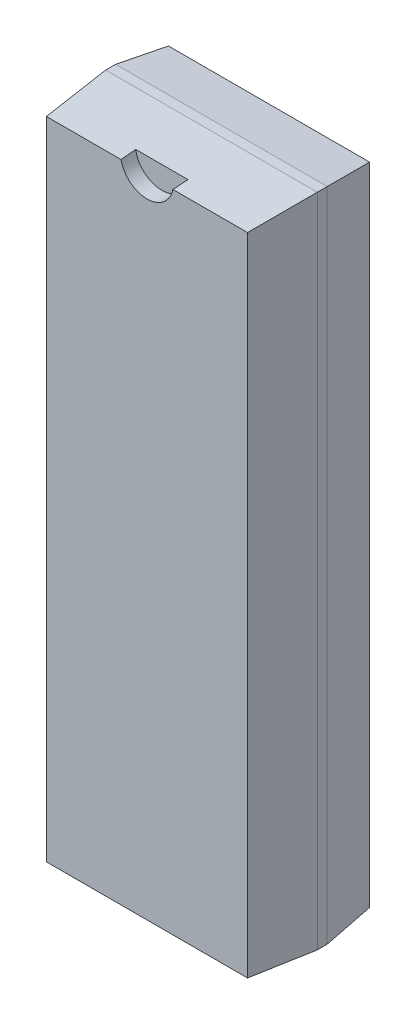
ISO-10303-21;
HEADER;
FILE_DESCRIPTION(('STEP AP214'),'2;1');
FILE_NAME('part.step','',(''),(''),'','','');
FILE_SCHEMA(('AUTOMOTIVE_DESIGN { 1 0 10303 214 1 1 1 1 }'));
ENDSEC;
DATA;
#1=APPLICATION_CONTEXT('core data for automotive mechanical design processes');
#2=APPLICATION_PROTOCOL_DEFINITION('international standard','automotive_design',2000,#1);
#3=PRODUCT_CONTEXT('',#1,'mechanical');
#4=PRODUCT('Part','Part','',(#3));
#5=PRODUCT_RELATED_PRODUCT_CATEGORY('part','',(#4));
#6=PRODUCT_DEFINITION_FORMATION('','',#4);
#7=PRODUCT_DEFINITION_CONTEXT('part definition',#1,'design');
#8=PRODUCT_DEFINITION('design','',#6,#7);
#9=PRODUCT_DEFINITION_SHAPE('','',#8);
#10=(LENGTH_UNIT() NAMED_UNIT(*) SI_UNIT(.MILLI.,.METRE.));
#11=(NAMED_UNIT(*) PLANE_ANGLE_UNIT() SI_UNIT($,.RADIAN.));
#12=(NAMED_UNIT(*) SI_UNIT($,.STERADIAN.) SOLID_ANGLE_UNIT());
#13=UNCERTAINTY_MEASURE_WITH_UNIT(LENGTH_MEASURE(1.E-05),#10,'distance_accuracy_value','');
#14=(GEOMETRIC_REPRESENTATION_CONTEXT(3) GLOBAL_UNCERTAINTY_ASSIGNED_CONTEXT((#13)) GLOBAL_UNIT_ASSIGNED_CONTEXT((#10,
#11,#12)) REPRESENTATION_CONTEXT('',''));
#15=CARTESIAN_POINT('',(0.,0.,0.));
#16=DIRECTION('',(0.,0.,1.));
#17=DIRECTION('',(1.,0.,0.));
#18=AXIS2_PLACEMENT_3D('',#15,#16,#17);
#19=CARTESIAN_POINT('',(0.,9.92,4.05));
#20=DIRECTION('',(0.,0.,1.));
#21=DIRECTION('',(1.,0.,0.));
#22=AXIS2_PLACEMENT_3D('',#19,#20,#21);
#23=PLANE('',#22);
#24=DIRECTION('',(-1.,0.,0.));
#25=VECTOR('',#24,1.);
#26=CARTESIAN_POINT('',(-1.6,9.796923076923,4.05));
#27=LINE('',#26,#25);
#28=CARTESIAN_POINT('',(0.790475850995,9.796923076923,4.05));
#29=VERTEX_POINT('',#28);
#30=CARTESIAN_POINT('',(-0.790475850995,9.796923076923,4.05));
#31=VERTEX_POINT('',#30);
#32=EDGE_CURVE('E168',#29,#31,#27,.T.);
#33=ORIENTED_EDGE('',*,*,#32,.T.);
#34=CARTESIAN_POINT('',(0.,9.92,4.05));
#35=DIRECTION('',(0.,0.,1.));
#36=DIRECTION('',(1.,0.,0.));
#37=AXIS2_PLACEMENT_3D('',#34,#35,#36);
#38=CIRCLE('',#37,0.8);
#39=EDGE_CURVE('E11',#31,#29,#38,.T.);
#40=ORIENTED_EDGE('',*,*,#39,.T.);
#41=EDGE_LOOP('',(#33,#40));
#42=FACE_BOUND('',#41,.T.);
#43=ADVANCED_FACE('F16',(#42),#23,.T.);
#44=CARTESIAN_POINT('',(0.,9.92,4.05));
#45=DIRECTION('',(0.,0.,1.));
#46=DIRECTION('',(1.,0.,0.));
#47=AXIS2_PLACEMENT_3D('',#44,#45,#46);
#48=CYLINDRICAL_SURFACE('',#47,0.8);
#49=CARTESIAN_POINT('',(0.,9.92,2.55));
#50=DIRECTION('',(0.,0.99665069577484,0.0817764673456069));
#51=DIRECTION('',(0.,-0.0817764673456069,0.99665069577484));
#52=AXIS2_PLACEMENT_3D('',#49,#50,#51);
#53=ELLIPSE('',#52,9.782765457681,0.8);
#54=CARTESIAN_POINT('',(0.783836717691,9.76,4.5));
#55=VERTEX_POINT('',#54);
#56=EDGE_CURVE('E171',#55,#29,#53,.T.);
#57=ORIENTED_EDGE('',*,*,#56,.T.);
#58=ORIENTED_EDGE('',*,*,#39,.F.);
#59=CARTESIAN_POINT('',(0.,9.92,2.55));
#60=DIRECTION('',(0.,0.99665069577484,0.0817764673456069));
#61=DIRECTION('',(0.,-0.0817764673456069,0.99665069577484));
#62=AXIS2_PLACEMENT_3D('',#59,#60,#61);
#63=ELLIPSE('',#62,9.782765457681,0.8);
#64=CARTESIAN_POINT('',(-0.783836717691,9.76,4.5));
#65=VERTEX_POINT('',#64);
#66=EDGE_CURVE('E172',#31,#65,#63,.T.);
#67=ORIENTED_EDGE('',*,*,#66,.T.);
#68=CARTESIAN_POINT('',(0.,9.92,4.5));
#69=DIRECTION('',(0.,0.,1.));
#70=DIRECTION('',(1.,0.,0.));
#71=AXIS2_PLACEMENT_3D('',#68,#69,#70);
#72=CIRCLE('',#71,0.8);
#73=EDGE_CURVE('E226',#65,#55,#72,.T.);
#74=ORIENTED_EDGE('',*,*,#73,.T.);
#75=EDGE_LOOP('',(#57,#58,#67,#74));
#76=FACE_BOUND('',#75,.T.);
#77=ADVANCED_FACE('F242',(#76),#48,.F.);
#78=CARTESIAN_POINT('',(3.12,-9.92,3.525));
#79=DIRECTION('',(0.99665069577484,0.,0.0817764673456069));
#80=DIRECTION('',(0.,-1.,0.));
#81=AXIS2_PLACEMENT_3D('',#78,#79,#80);
#82=PLANE('',#81);
#83=DIRECTION('',(-0.0815043955853222,0.0815043955853222,0.993334821196027));
#84=VECTOR('',#83,1.);
#85=CARTESIAN_POINT('',(3.099273944521,-9.819273944521,3.777598801152));
#86=LINE('',#85,#84);
#87=CARTESIAN_POINT('',(3.2,-9.92,2.55));
#88=VERTEX_POINT('',#87);
#89=CARTESIAN_POINT('',(3.04,-9.76,4.5));
#90=VERTEX_POINT('',#89);
#91=EDGE_CURVE('E181',#88,#90,#86,.T.);
#92=ORIENTED_EDGE('',*,*,#91,.F.);
#93=DIRECTION('',(0.,1.,0.));
#94=VECTOR('',#93,1.);
#95=CARTESIAN_POINT('',(3.2,-9.92,2.55));
#96=LINE('',#95,#94);
#97=CARTESIAN_POINT('',(3.2,9.92,2.55));
#98=VERTEX_POINT('',#97);
#99=EDGE_CURVE('E132',#88,#98,#96,.T.);
#100=ORIENTED_EDGE('',*,*,#99,.T.);
#101=DIRECTION('',(-0.0815043955853222,-0.0815043955853222,0.993334821196027));
#102=VECTOR('',#101,1.);
#103=CARTESIAN_POINT('',(3.033375716844,9.753375716844,4.580733450969));
#104=LINE('',#103,#102);
#105=CARTESIAN_POINT('',(3.04,9.76,4.5));
#106=VERTEX_POINT('',#105);
#107=EDGE_CURVE('E27',#98,#106,#104,.T.);
#108=ORIENTED_EDGE('',*,*,#107,.T.);
#109=DIRECTION('',(0.,1.,0.));
#110=VECTOR('',#109,1.);
#111=CARTESIAN_POINT('',(3.04,-9.92,4.5));
#112=LINE('',#111,#110);
#113=EDGE_CURVE('E120',#90,#106,#112,.T.);
#114=ORIENTED_EDGE('',*,*,#113,.F.);
#115=EDGE_LOOP('',(#92,#100,#108,#114));
#116=FACE_BOUND('',#115,.T.);
#117=ADVANCED_FACE('F253',(#116),#82,.T.);
#118=CARTESIAN_POINT('',(3.12,-9.92,1.53));
#119=DIRECTION('',(-0.993883734673607,0.,0.110431526074956));
#120=DIRECTION('',(0.,1.,0.));
#121=AXIS2_PLACEMENT_3D('',#118,#119,#120);
#122=PLANE('',#121);
#123=DIRECTION('',(0.,1.,0.));
#124=VECTOR('',#123,1.);
#125=CARTESIAN_POINT('',(3.04,-9.92,0.81));
#126=LINE('',#125,#124);
#127=CARTESIAN_POINT('',(3.04,-9.76,0.81));
#128=VERTEX_POINT('',#127);
#129=CARTESIAN_POINT('',(3.04,9.76,0.81));
#130=VERTEX_POINT('',#129);
#131=EDGE_CURVE('E115',#128,#130,#126,.T.);
#132=ORIENTED_EDGE('',*,*,#131,.T.);
#133=DIRECTION('',(-0.109764259990016,-0.109764259990016,-0.987878339907141));
#134=VECTOR('',#133,1.);
#135=CARTESIAN_POINT('',(2.962891566265,9.682891566265,0.116024096386));
#136=LINE('',#135,#134);
#137=CARTESIAN_POINT('',(3.2,9.92,2.25));
#138=VERTEX_POINT('',#137);
#139=EDGE_CURVE('E109',#138,#130,#136,.T.);
#140=ORIENTED_EDGE('',*,*,#139,.F.);
#141=DIRECTION('',(0.,1.,0.));
#142=VECTOR('',#141,1.);
#143=CARTESIAN_POINT('',(3.2,-9.92,2.25));
#144=LINE('',#143,#142);
#145=CARTESIAN_POINT('',(3.2,-9.92,2.25));
#146=VERTEX_POINT('',#145);
#147=EDGE_CURVE('E113',#146,#138,#144,.T.);
#148=ORIENTED_EDGE('',*,*,#147,.F.);
#149=DIRECTION('',(-0.109764259990016,0.109764259990016,-0.987878339907141));
#150=VECTOR('',#149,1.);
#151=CARTESIAN_POINT('',(3.082409638554,-9.802409638554,1.191686746988));
#152=LINE('',#151,#150);
#153=EDGE_CURVE('E194',#146,#128,#152,.T.);
#154=ORIENTED_EDGE('',*,*,#153,.T.);
#155=EDGE_LOOP('',(#132,#140,#148,#154));
#156=FACE_BOUND('',#155,.T.);
#157=ADVANCED_FACE('F111',(#156),#122,.F.);
#158=CARTESIAN_POINT('',(-3.2,9.84,3.525));
#159=DIRECTION('',(0.,0.99665069577484,0.0817764673456069));
#160=DIRECTION('',(1.,0.,0.));
#161=AXIS2_PLACEMENT_3D('',#158,#159,#160);
#162=PLANE('',#161);
#163=DIRECTION('',(1.,0.,0.));
#164=VECTOR('',#163,1.);
#165=CARTESIAN_POINT('',(-3.2,9.76,4.5));
#166=LINE('',#165,#164);
#167=CARTESIAN_POINT('',(-3.04,9.76,4.5));
#168=VERTEX_POINT('',#167);
#169=EDGE_CURVE('E227',#168,#65,#166,.T.);
#170=ORIENTED_EDGE('',*,*,#169,.T.);
#171=ORIENTED_EDGE('',*,*,#66,.F.);
#172=ORIENTED_EDGE('',*,*,#32,.F.);
#173=ORIENTED_EDGE('',*,*,#56,.F.);
#174=DIRECTION('',(1.,0.,0.));
#175=VECTOR('',#174,1.);
#176=CARTESIAN_POINT('',(-3.2,9.76,4.5));
#177=LINE('',#176,#175);
#178=EDGE_CURVE('E222',#55,#106,#177,.T.);
#179=ORIENTED_EDGE('',*,*,#178,.T.);
#180=ORIENTED_EDGE('',*,*,#107,.F.);
#181=DIRECTION('',(1.,0.,0.));
#182=VECTOR('',#181,1.);
#183=CARTESIAN_POINT('',(-3.2,9.92,2.55));
#184=LINE('',#183,#182);
#185=CARTESIAN_POINT('',(-3.2,9.92,2.55));
#186=VERTEX_POINT('',#185);
#187=EDGE_CURVE('E133',#186,#98,#184,.T.);
#188=ORIENTED_EDGE('',*,*,#187,.F.);
#189=DIRECTION('',(0.0815043955853222,-0.0815043955853222,0.993334821196027));
#190=VECTOR('',#189,1.);
#191=CARTESIAN_POINT('',(-3.054633209643,9.774633209643,4.32165775748));
#192=LINE('',#191,#190);
#193=EDGE_CURVE('E155',#186,#168,#192,.T.);
#194=ORIENTED_EDGE('',*,*,#193,.T.);
#195=EDGE_LOOP('',(#170,#171,#172,#173,#179,#180,#188,#194));
#196=FACE_BOUND('',#195,.T.);
#197=ADVANCED_FACE('F18',(#196),#162,.T.);
#198=CARTESIAN_POINT('',(-3.2,-9.92,4.5));
#199=DIRECTION('',(0.,0.,1.));
#200=DIRECTION('',(1.,0.,0.));
#201=AXIS2_PLACEMENT_3D('',#198,#199,#200);
#202=PLANE('',#201);
#203=DIRECTION('',(0.,1.,0.));
#204=VECTOR('',#203,1.);
#205=CARTESIAN_POINT('',(-3.04,-9.92,4.5));
#206=LINE('',#205,#204);
#207=CARTESIAN_POINT('',(-3.04,-9.76,4.5));
#208=VERTEX_POINT('',#207);
#209=EDGE_CURVE('E185',#208,#168,#206,.T.);
#210=ORIENTED_EDGE('',*,*,#209,.F.);
#211=DIRECTION('',(1.,0.,0.));
#212=VECTOR('',#211,1.);
#213=CARTESIAN_POINT('',(-3.2,-9.76,4.5));
#214=LINE('',#213,#212);
#215=EDGE_CURVE('E176',#208,#90,#214,.T.);
#216=ORIENTED_EDGE('',*,*,#215,.T.);
#217=ORIENTED_EDGE('',*,*,#113,.T.);
#218=ORIENTED_EDGE('',*,*,#178,.F.);
#219=ORIENTED_EDGE('',*,*,#73,.F.);
#220=ORIENTED_EDGE('',*,*,#169,.F.);
#221=EDGE_LOOP('',(#210,#216,#217,#218,#219,#220));
#222=FACE_BOUND('',#221,.T.);
#223=ADVANCED_FACE('F268',(#222),#202,.T.);
#224=CARTESIAN_POINT('',(-3.2,9.84,1.53));
#225=DIRECTION('',(0.,-0.993883734673607,0.110431526074956));
#226=DIRECTION('',(-1.,0.,0.));
#227=AXIS2_PLACEMENT_3D('',#224,#225,#226);
#228=PLANE('',#227);
#229=DIRECTION('',(0.109764259990016,-0.109764259990016,-0.987878339907141));
#230=VECTOR('',#229,1.);
#231=CARTESIAN_POINT('',(-3.001445783133,9.721445783133,0.463012048193));
#232=LINE('',#231,#230);
#233=CARTESIAN_POINT('',(-3.2,9.92,2.25));
#234=VERTEX_POINT('',#233);
#235=CARTESIAN_POINT('',(-3.04,9.76,0.81));
#236=VERTEX_POINT('',#235);
#237=EDGE_CURVE('E139',#234,#236,#232,.T.);
#238=ORIENTED_EDGE('',*,*,#237,.F.);
#239=DIRECTION('',(1.,0.,0.));
#240=VECTOR('',#239,1.);
#241=CARTESIAN_POINT('',(-3.2,9.92,2.25));
#242=LINE('',#241,#240);
#243=EDGE_CURVE('E136',#234,#138,#242,.T.);
#244=ORIENTED_EDGE('',*,*,#243,.T.);
#245=ORIENTED_EDGE('',*,*,#139,.T.);
#246=DIRECTION('',(1.,0.,0.));
#247=VECTOR('',#246,1.);
#248=CARTESIAN_POINT('',(-3.2,9.76,0.81));
#249=LINE('',#248,#247);
#250=EDGE_CURVE('E180',#236,#130,#249,.T.);
#251=ORIENTED_EDGE('',*,*,#250,.F.);
#252=EDGE_LOOP('',(#238,#244,#245,#251));
#253=FACE_BOUND('',#252,.T.);
#254=ADVANCED_FACE('F137',(#253),#228,.F.);
#255=CARTESIAN_POINT('',(-3.2,-9.92,0.81));
#256=DIRECTION('',(0.,0.,1.));
#257=DIRECTION('',(1.,0.,0.));
#258=AXIS2_PLACEMENT_3D('',#255,#256,#257);
#259=PLANE('',#258);
#260=ORIENTED_EDGE('',*,*,#250,.T.);
#261=ORIENTED_EDGE('',*,*,#131,.F.);
#262=DIRECTION('',(1.,0.,0.));
#263=VECTOR('',#262,1.);
#264=CARTESIAN_POINT('',(-3.2,-9.76,0.81));
#265=LINE('',#264,#263);
#266=CARTESIAN_POINT('',(-3.04,-9.76,0.81));
#267=VERTEX_POINT('',#266);
#268=EDGE_CURVE('E191',#267,#128,#265,.T.);
#269=ORIENTED_EDGE('',*,*,#268,.F.);
#270=DIRECTION('',(0.,1.,0.));
#271=VECTOR('',#270,1.);
#272=CARTESIAN_POINT('',(-3.04,-9.92,0.81));
#273=LINE('',#272,#271);
#274=EDGE_CURVE('E20',#267,#236,#273,.T.);
#275=ORIENTED_EDGE('',*,*,#274,.T.);
#276=EDGE_LOOP('',(#260,#261,#269,#275));
#277=FACE_BOUND('',#276,.T.);
#278=ADVANCED_FACE('F267',(#277),#259,.F.);
#279=CARTESIAN_POINT('',(-3.2,-9.84,3.525));
#280=DIRECTION('',(0.,0.99665069577484,-0.0817764673456069));
#281=DIRECTION('',(-1.,0.,0.));
#282=AXIS2_PLACEMENT_3D('',#279,#280,#281);
#283=PLANE('',#282);
#284=DIRECTION('',(0.0815043955853222,0.0815043955853222,0.993334821196027));
#285=VECTOR('',#284,1.);
#286=CARTESIAN_POINT('',(-3.12053143732,-9.84053143732,3.518523107663));
#287=LINE('',#286,#285);
#288=CARTESIAN_POINT('',(-3.2,-9.92,2.55));
#289=VERTEX_POINT('',#288);
#290=EDGE_CURVE('E148',#289,#208,#287,.T.);
#291=ORIENTED_EDGE('',*,*,#290,.F.);
#292=DIRECTION('',(1.,0.,0.));
#293=VECTOR('',#292,1.);
#294=CARTESIAN_POINT('',(-3.2,-9.92,2.55));
#295=LINE('',#294,#293);
#296=EDGE_CURVE('E159',#289,#88,#295,.T.);
#297=ORIENTED_EDGE('',*,*,#296,.T.);
#298=ORIENTED_EDGE('',*,*,#91,.T.);
#299=ORIENTED_EDGE('',*,*,#215,.F.);
#300=EDGE_LOOP('',(#291,#297,#298,#299));
#301=FACE_BOUND('',#300,.T.);
#302=ADVANCED_FACE('F272',(#301),#283,.F.);
#303=CARTESIAN_POINT('',(-3.2,-9.84,1.53));
#304=DIRECTION('',(0.,-0.993883734673607,-0.110431526074956));
#305=DIRECTION('',(0.,0.110431526074956,-0.993883734673607));
#306=AXIS2_PLACEMENT_3D('',#303,#304,#305);
#307=PLANE('',#306);
#308=ORIENTED_EDGE('',*,*,#268,.T.);
#309=ORIENTED_EDGE('',*,*,#153,.F.);
#310=DIRECTION('',(1.,0.,0.));
#311=VECTOR('',#310,1.);
#312=CARTESIAN_POINT('',(-3.2,-9.92,2.25));
#313=LINE('',#312,#311);
#314=CARTESIAN_POINT('',(-3.2,-9.92,2.25));
#315=VERTEX_POINT('',#314);
#316=EDGE_CURVE('E207',#315,#146,#313,.T.);
#317=ORIENTED_EDGE('',*,*,#316,.F.);
#318=DIRECTION('',(0.109764259990016,0.109764259990016,-0.987878339907141));
#319=VECTOR('',#318,1.);
#320=CARTESIAN_POINT('',(-3.120963855422,-9.840963855422,1.538674698795));
#321=LINE('',#320,#319);
#322=EDGE_CURVE('E174',#315,#267,#321,.T.);
#323=ORIENTED_EDGE('',*,*,#322,.T.);
#324=EDGE_LOOP('',(#308,#309,#317,#323));
#325=FACE_BOUND('',#324,.T.);
#326=ADVANCED_FACE('F271',(#325),#307,.T.);
#327=CARTESIAN_POINT('',(3.2,-9.92,0.81));
#328=DIRECTION('',(1.,0.,0.));
#329=DIRECTION('',(0.,1.,0.));
#330=AXIS2_PLACEMENT_3D('',#327,#328,#329);
#331=PLANE('',#330);
#332=DIRECTION('',(0.,0.,1.));
#333=VECTOR('',#332,1.);
#334=CARTESIAN_POINT('',(3.2,-9.92,0.81));
#335=LINE('',#334,#333);
#336=EDGE_CURVE('E129',#146,#88,#335,.T.);
#337=ORIENTED_EDGE('',*,*,#336,.F.);
#338=ORIENTED_EDGE('',*,*,#147,.T.);
#339=DIRECTION('',(0.,0.,1.));
#340=VECTOR('',#339,1.);
#341=CARTESIAN_POINT('',(3.2,9.92,0.81));
#342=LINE('',#341,#340);
#343=EDGE_CURVE('E127',#138,#98,#342,.T.);
#344=ORIENTED_EDGE('',*,*,#343,.T.);
#345=ORIENTED_EDGE('',*,*,#99,.F.);
#346=EDGE_LOOP('',(#337,#338,#344,#345));
#347=FACE_BOUND('',#346,.T.);
#348=ADVANCED_FACE('F124',(#347),#331,.T.);
#349=CARTESIAN_POINT('',(-3.2,9.92,0.81));
#350=DIRECTION('',(0.,1.,0.));
#351=DIRECTION('',(1.,0.,0.));
#352=AXIS2_PLACEMENT_3D('',#349,#350,#351);
#353=PLANE('',#352);
#354=ORIENTED_EDGE('',*,*,#343,.F.);
#355=ORIENTED_EDGE('',*,*,#243,.F.);
#356=DIRECTION('',(0.,0.,1.));
#357=VECTOR('',#356,1.);
#358=CARTESIAN_POINT('',(-3.2,9.92,0.81));
#359=LINE('',#358,#357);
#360=EDGE_CURVE('E167',#234,#186,#359,.T.);
#361=ORIENTED_EDGE('',*,*,#360,.T.);
#362=ORIENTED_EDGE('',*,*,#187,.T.);
#363=EDGE_LOOP('',(#354,#355,#361,#362));
#364=FACE_BOUND('',#363,.T.);
#365=ADVANCED_FACE('F146',(#364),#353,.T.);
#366=CARTESIAN_POINT('',(-3.12,-9.92,3.525));
#367=DIRECTION('',(0.99665069577484,0.,-0.0817764673456069));
#368=DIRECTION('',(0.,-1.,0.));
#369=AXIS2_PLACEMENT_3D('',#366,#367,#368);
#370=PLANE('',#369);
#371=ORIENTED_EDGE('',*,*,#209,.T.);
#372=ORIENTED_EDGE('',*,*,#193,.F.);
#373=DIRECTION('',(0.,1.,0.));
#374=VECTOR('',#373,1.);
#375=CARTESIAN_POINT('',(-3.2,-9.92,2.55));
#376=LINE('',#375,#374);
#377=EDGE_CURVE('E163',#289,#186,#376,.T.);
#378=ORIENTED_EDGE('',*,*,#377,.F.);
#379=ORIENTED_EDGE('',*,*,#290,.T.);
#380=EDGE_LOOP('',(#371,#372,#378,#379));
#381=FACE_BOUND('',#380,.T.);
#382=ADVANCED_FACE('F261',(#381),#370,.F.);
#383=CARTESIAN_POINT('',(-3.12,-9.92,1.53));
#384=DIRECTION('',(-0.993883734673607,0.,-0.110431526074956));
#385=DIRECTION('',(-0.110431526074956,0.,0.993883734673607));
#386=AXIS2_PLACEMENT_3D('',#383,#384,#385);
#387=PLANE('',#386);
#388=ORIENTED_EDGE('',*,*,#322,.F.);
#389=DIRECTION('',(0.,1.,0.));
#390=VECTOR('',#389,1.);
#391=CARTESIAN_POINT('',(-3.2,-9.92,2.25));
#392=LINE('',#391,#390);
#393=EDGE_CURVE('E190',#315,#234,#392,.T.);
#394=ORIENTED_EDGE('',*,*,#393,.T.);
#395=ORIENTED_EDGE('',*,*,#237,.T.);
#396=ORIENTED_EDGE('',*,*,#274,.F.);
#397=EDGE_LOOP('',(#388,#394,#395,#396));
#398=FACE_BOUND('',#397,.T.);
#399=ADVANCED_FACE('F260',(#398),#387,.T.);
#400=CARTESIAN_POINT('',(-3.2,-9.92,0.81));
#401=DIRECTION('',(0.,1.,0.));
#402=DIRECTION('',(1.,0.,0.));
#403=AXIS2_PLACEMENT_3D('',#400,#401,#402);
#404=PLANE('',#403);
#405=ORIENTED_EDGE('',*,*,#296,.F.);
#406=DIRECTION('',(0.,0.,1.));
#407=VECTOR('',#406,1.);
#408=CARTESIAN_POINT('',(-3.2,-9.92,0.81));
#409=LINE('',#408,#407);
#410=EDGE_CURVE('E186',#315,#289,#409,.T.);
#411=ORIENTED_EDGE('',*,*,#410,.F.);
#412=ORIENTED_EDGE('',*,*,#316,.T.);
#413=ORIENTED_EDGE('',*,*,#336,.T.);
#414=EDGE_LOOP('',(#405,#411,#412,#413));
#415=FACE_BOUND('',#414,.T.);
#416=ADVANCED_FACE('F256',(#415),#404,.F.);
#417=CARTESIAN_POINT('',(-3.2,-9.92,0.81));
#418=DIRECTION('',(1.,0.,0.));
#419=DIRECTION('',(0.,1.,0.));
#420=AXIS2_PLACEMENT_3D('',#417,#418,#419);
#421=PLANE('',#420);
#422=ORIENTED_EDGE('',*,*,#377,.T.);
#423=ORIENTED_EDGE('',*,*,#360,.F.);
#424=ORIENTED_EDGE('',*,*,#393,.F.);
#425=ORIENTED_EDGE('',*,*,#410,.T.);
#426=EDGE_LOOP('',(#422,#423,#424,#425));
#427=FACE_BOUND('',#426,.T.);
#428=ADVANCED_FACE('F259',(#427),#421,.F.);
#429=CLOSED_SHELL('',(#43,#77,#117,#157,#197,#223,#254,#278,#302,#326,#348,#365,#382,#399,#416,#428));
#430=MANIFOLD_SOLID_BREP('B1',#429);
#431=ADVANCED_BREP_SHAPE_REPRESENTATION('',(#18,#430),#14);
#432=SHAPE_DEFINITION_REPRESENTATION(#9,#431);
ENDSEC;
END-ISO-10303-21;
